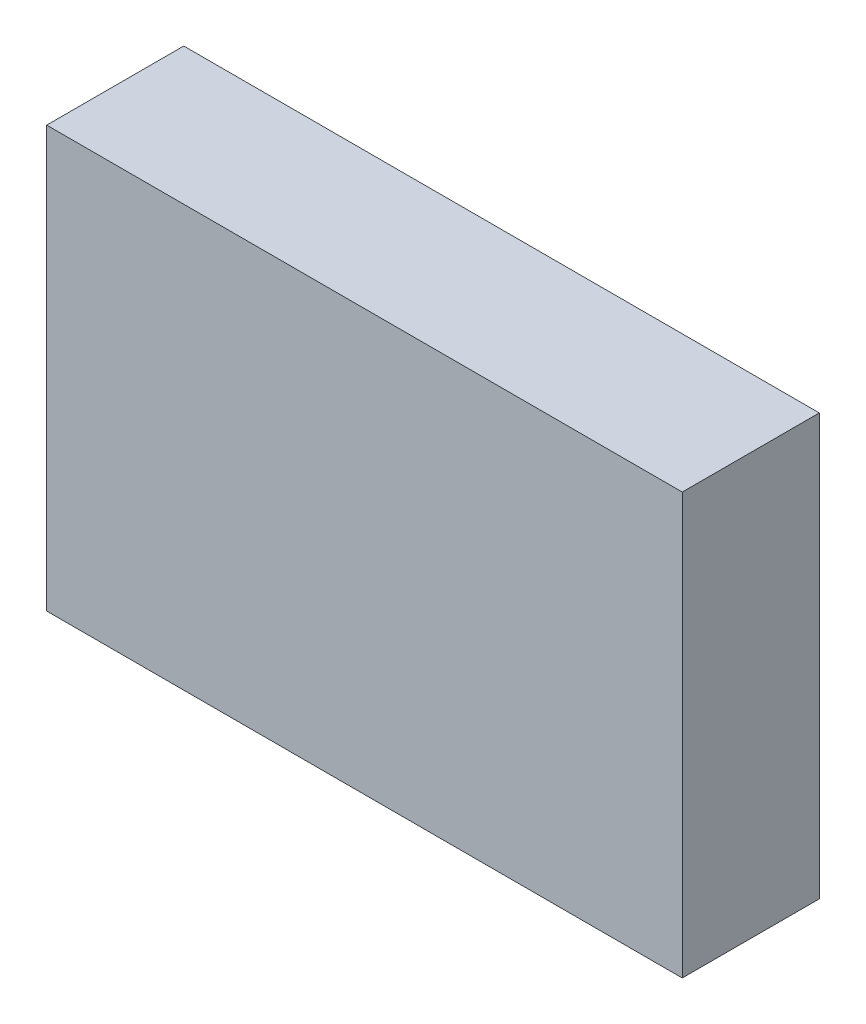
ISO-10303-21;
HEADER;
FILE_DESCRIPTION(('STEP AP214'),'2;1');
FILE_NAME('part.step','',(''),(''),'','','');
FILE_SCHEMA(('AUTOMOTIVE_DESIGN { 1 0 10303 214 1 1 1 1 }'));
ENDSEC;
DATA;
#1=APPLICATION_CONTEXT('core data for automotive mechanical design processes');
#2=APPLICATION_PROTOCOL_DEFINITION('international standard','automotive_design',2000,#1);
#3=PRODUCT_CONTEXT('',#1,'mechanical');
#4=PRODUCT('Part','Part','',(#3));
#5=PRODUCT_RELATED_PRODUCT_CATEGORY('part','',(#4));
#6=PRODUCT_DEFINITION_FORMATION('','',#4);
#7=PRODUCT_DEFINITION_CONTEXT('part definition',#1,'design');
#8=PRODUCT_DEFINITION('design','',#6,#7);
#9=PRODUCT_DEFINITION_SHAPE('','',#8);
#10=(LENGTH_UNIT() NAMED_UNIT(*) SI_UNIT(.MILLI.,.METRE.));
#11=(NAMED_UNIT(*) PLANE_ANGLE_UNIT() SI_UNIT($,.RADIAN.));
#12=(NAMED_UNIT(*) SI_UNIT($,.STERADIAN.) SOLID_ANGLE_UNIT());
#13=UNCERTAINTY_MEASURE_WITH_UNIT(LENGTH_MEASURE(1.E-05),#10,'distance_accuracy_value','');
#14=(GEOMETRIC_REPRESENTATION_CONTEXT(3) GLOBAL_UNCERTAINTY_ASSIGNED_CONTEXT((#13)) GLOBAL_UNIT_ASSIGNED_CONTEXT((#10,
#11,#12)) REPRESENTATION_CONTEXT('',''));
#15=CARTESIAN_POINT('',(0.,0.,0.));
#16=DIRECTION('',(0.,0.,1.));
#17=DIRECTION('',(1.,0.,0.));
#18=AXIS2_PLACEMENT_3D('',#15,#16,#17);
#19=CARTESIAN_POINT('',(-92.456,6.8834,1.6374872));
#20=DIRECTION('',(0.,0.,-1.));
#21=DIRECTION('',(-1.,0.,0.));
#22=AXIS2_PLACEMENT_3D('',#19,#20,#21);
#23=PLANE('',#22);
#24=DIRECTION('',(0.,1.,0.));
#25=VECTOR('',#24,1.);
#26=CARTESIAN_POINT('',(-84.8614,6.8834,1.6374872));
#27=LINE('',#26,#25);
#28=CARTESIAN_POINT('',(-84.8614,6.8834,1.6374872));
#29=VERTEX_POINT('',#28);
#30=CARTESIAN_POINT('',(-84.8614,11.9126,1.6374872));
#31=VERTEX_POINT('',#30);
#32=EDGE_CURVE('E55',#29,#31,#27,.T.);
#33=ORIENTED_EDGE('',*,*,#32,.T.);
#34=DIRECTION('',(1.,0.,0.));
#35=VECTOR('',#34,1.);
#36=CARTESIAN_POINT('',(-84.8614,11.9126,1.6374872));
#37=LINE('',#36,#35);
#38=CARTESIAN_POINT('',(-92.456,11.9126,1.6374872));
#39=VERTEX_POINT('',#38);
#40=EDGE_CURVE('E57',#31,#39,#37,.F.);
#41=ORIENTED_EDGE('',*,*,#40,.T.);
#42=DIRECTION('',(0.,1.,0.));
#43=VECTOR('',#42,1.);
#44=CARTESIAN_POINT('',(-92.456,11.9126,1.6374872));
#45=LINE('',#44,#43);
#46=CARTESIAN_POINT('',(-92.456,6.8834,1.6374872));
#47=VERTEX_POINT('',#46);
#48=EDGE_CURVE('E20',#39,#47,#45,.F.);
#49=ORIENTED_EDGE('',*,*,#48,.T.);
#50=DIRECTION('',(1.,0.,0.));
#51=VECTOR('',#50,1.);
#52=CARTESIAN_POINT('',(-92.456,6.8834,1.6374872));
#53=LINE('',#52,#51);
#54=EDGE_CURVE('E80',#47,#29,#53,.T.);
#55=ORIENTED_EDGE('',*,*,#54,.T.);
#56=EDGE_LOOP('',(#33,#41,#49,#55));
#57=FACE_BOUND('',#56,.T.);
#58=ADVANCED_FACE('F17',(#57),#23,.F.);
#59=CARTESIAN_POINT('',(-92.456,11.9126,0.));
#60=DIRECTION('',(1.,0.,0.));
#61=DIRECTION('',(0.,0.,-1.));
#62=AXIS2_PLACEMENT_3D('',#59,#60,#61);
#63=PLANE('',#62);
#64=DIRECTION('',(0.,0.,1.));
#65=VECTOR('',#64,1.);
#66=CARTESIAN_POINT('',(-92.456,6.8834,0.));
#67=LINE('',#66,#65);
#68=CARTESIAN_POINT('',(-92.456,6.8834,0.));
#69=VERTEX_POINT('',#68);
#70=EDGE_CURVE('E68',#69,#47,#67,.T.);
#71=ORIENTED_EDGE('',*,*,#70,.T.);
#72=ORIENTED_EDGE('',*,*,#48,.F.);
#73=DIRECTION('',(0.,0.,-1.));
#74=VECTOR('',#73,1.);
#75=CARTESIAN_POINT('',(-92.456,11.9126,0.));
#76=LINE('',#75,#74);
#77=CARTESIAN_POINT('',(-92.456,11.9126,0.));
#78=VERTEX_POINT('',#77);
#79=EDGE_CURVE('E63',#39,#78,#76,.T.);
#80=ORIENTED_EDGE('',*,*,#79,.T.);
#81=DIRECTION('',(0.,1.,0.));
#82=VECTOR('',#81,1.);
#83=CARTESIAN_POINT('',(-92.456,6.8834,0.));
#84=LINE('',#83,#82);
#85=EDGE_CURVE('E83',#69,#78,#84,.T.);
#86=ORIENTED_EDGE('',*,*,#85,.F.);
#87=EDGE_LOOP('',(#71,#72,#80,#86));
#88=FACE_BOUND('',#87,.T.);
#89=ADVANCED_FACE('F65',(#88),#63,.F.);
#90=CARTESIAN_POINT('',(-84.8614,11.9126,0.));
#91=DIRECTION('',(0.,-1.,0.));
#92=DIRECTION('',(0.,0.,-1.));
#93=AXIS2_PLACEMENT_3D('',#90,#91,#92);
#94=PLANE('',#93);
#95=ORIENTED_EDGE('',*,*,#79,.F.);
#96=ORIENTED_EDGE('',*,*,#40,.F.);
#97=DIRECTION('',(0.,0.,1.));
#98=VECTOR('',#97,1.);
#99=CARTESIAN_POINT('',(-84.8614,11.9126,0.));
#100=LINE('',#99,#98);
#101=CARTESIAN_POINT('',(-84.8614,11.9126,0.));
#102=VERTEX_POINT('',#101);
#103=EDGE_CURVE('E75',#31,#102,#100,.F.);
#104=ORIENTED_EDGE('',*,*,#103,.T.);
#105=DIRECTION('',(-1.,0.,0.));
#106=VECTOR('',#105,1.);
#107=CARTESIAN_POINT('',(-92.456,11.9126,0.));
#108=LINE('',#107,#106);
#109=EDGE_CURVE('E72',#78,#102,#108,.F.);
#110=ORIENTED_EDGE('',*,*,#109,.F.);
#111=EDGE_LOOP('',(#95,#96,#104,#110));
#112=FACE_BOUND('',#111,.T.);
#113=ADVANCED_FACE('F70',(#112),#94,.F.);
#114=CARTESIAN_POINT('',(-84.8614,6.8834,0.));
#115=DIRECTION('',(-1.,0.,0.));
#116=DIRECTION('',(0.,0.,1.));
#117=AXIS2_PLACEMENT_3D('',#114,#115,#116);
#118=PLANE('',#117);
#119=ORIENTED_EDGE('',*,*,#103,.F.);
#120=ORIENTED_EDGE('',*,*,#32,.F.);
#121=DIRECTION('',(0.,0.,1.));
#122=VECTOR('',#121,1.);
#123=CARTESIAN_POINT('',(-84.8614,6.8834,0.));
#124=LINE('',#123,#122);
#125=CARTESIAN_POINT('',(-84.8614,6.8834,0.));
#126=VERTEX_POINT('',#125);
#127=EDGE_CURVE('E35',#29,#126,#124,.F.);
#128=ORIENTED_EDGE('',*,*,#127,.T.);
#129=DIRECTION('',(0.,1.,0.));
#130=VECTOR('',#129,1.);
#131=CARTESIAN_POINT('',(-84.8614,6.8834,0.));
#132=LINE('',#131,#130);
#133=EDGE_CURVE('E26',#102,#126,#132,.F.);
#134=ORIENTED_EDGE('',*,*,#133,.F.);
#135=EDGE_LOOP('',(#119,#120,#128,#134));
#136=FACE_BOUND('',#135,.T.);
#137=ADVANCED_FACE('F89',(#136),#118,.F.);
#138=CARTESIAN_POINT('',(-92.456,6.8834,0.));
#139=DIRECTION('',(0.,1.,0.));
#140=DIRECTION('',(0.,0.,1.));
#141=AXIS2_PLACEMENT_3D('',#138,#139,#140);
#142=PLANE('',#141);
#143=ORIENTED_EDGE('',*,*,#127,.F.);
#144=ORIENTED_EDGE('',*,*,#54,.F.);
#145=ORIENTED_EDGE('',*,*,#70,.F.);
#146=DIRECTION('',(-1.,0.,0.));
#147=VECTOR('',#146,1.);
#148=CARTESIAN_POINT('',(-92.456,6.8834,0.));
#149=LINE('',#148,#147);
#150=EDGE_CURVE('E11',#126,#69,#149,.T.);
#151=ORIENTED_EDGE('',*,*,#150,.F.);
#152=EDGE_LOOP('',(#143,#144,#145,#151));
#153=FACE_BOUND('',#152,.T.);
#154=ADVANCED_FACE('F91',(#153),#142,.F.);
#155=CARTESIAN_POINT('',(-92.456,6.8834,0.));
#156=DIRECTION('',(0.,0.,-1.));
#157=DIRECTION('',(-1.,0.,0.));
#158=AXIS2_PLACEMENT_3D('',#155,#156,#157);
#159=PLANE('',#158);
#160=ORIENTED_EDGE('',*,*,#133,.T.);
#161=ORIENTED_EDGE('',*,*,#150,.T.);
#162=ORIENTED_EDGE('',*,*,#85,.T.);
#163=ORIENTED_EDGE('',*,*,#109,.T.);
#164=EDGE_LOOP('',(#160,#161,#162,#163));
#165=FACE_BOUND('',#164,.T.);
#166=ADVANCED_FACE('F88',(#165),#159,.T.);
#167=CLOSED_SHELL('',(#58,#89,#113,#137,#154,#166));
#168=MANIFOLD_SOLID_BREP('B1',#167);
#169=ADVANCED_BREP_SHAPE_REPRESENTATION('',(#18,#168),#14);
#170=SHAPE_DEFINITION_REPRESENTATION(#9,#169);
ENDSEC;
END-ISO-10303-21;
